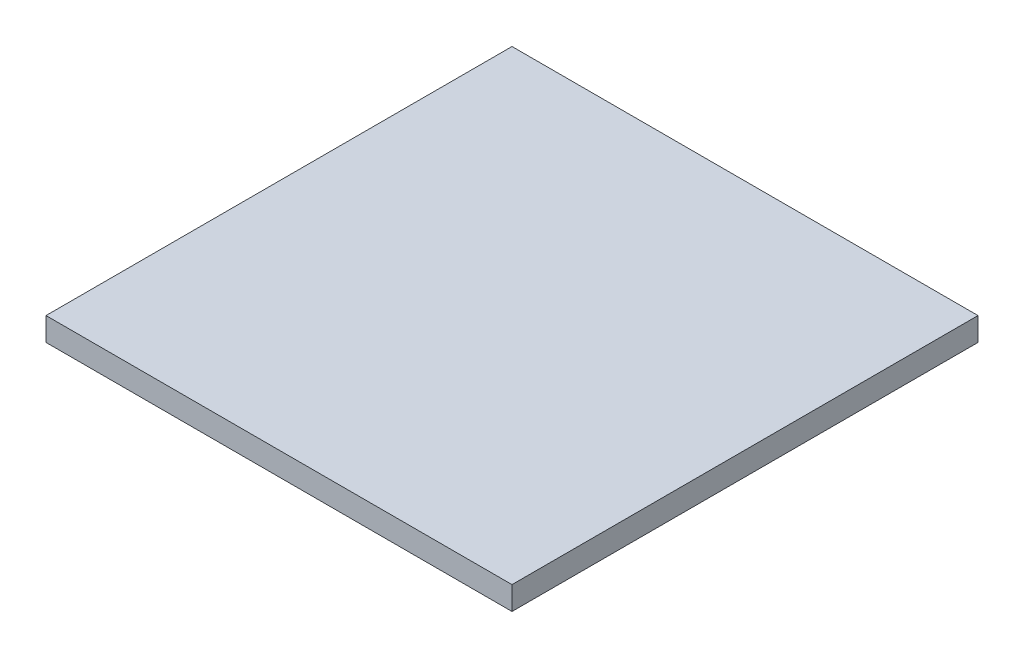
ISO-10303-21;
HEADER;
FILE_DESCRIPTION(('STEP AP214'),'2;1');
FILE_NAME('part.step','',(''),(''),'','','');
FILE_SCHEMA(('AUTOMOTIVE_DESIGN { 1 0 10303 214 1 1 1 1 }'));
ENDSEC;
DATA;
#1=APPLICATION_CONTEXT('core data for automotive mechanical design processes');
#2=APPLICATION_PROTOCOL_DEFINITION('international standard','automotive_design',2000,#1);
#3=PRODUCT_CONTEXT('',#1,'mechanical');
#4=PRODUCT('Part','Part','',(#3));
#5=PRODUCT_RELATED_PRODUCT_CATEGORY('part','',(#4));
#6=PRODUCT_DEFINITION_FORMATION('','',#4);
#7=PRODUCT_DEFINITION_CONTEXT('part definition',#1,'design');
#8=PRODUCT_DEFINITION('design','',#6,#7);
#9=PRODUCT_DEFINITION_SHAPE('','',#8);
#10=(LENGTH_UNIT() NAMED_UNIT(*) SI_UNIT(.MILLI.,.METRE.));
#11=(NAMED_UNIT(*) PLANE_ANGLE_UNIT() SI_UNIT($,.RADIAN.));
#12=(NAMED_UNIT(*) SI_UNIT($,.STERADIAN.) SOLID_ANGLE_UNIT());
#13=UNCERTAINTY_MEASURE_WITH_UNIT(LENGTH_MEASURE(1.E-05),#10,'distance_accuracy_value','');
#14=(GEOMETRIC_REPRESENTATION_CONTEXT(3) GLOBAL_UNCERTAINTY_ASSIGNED_CONTEXT((#13)) GLOBAL_UNIT_ASSIGNED_CONTEXT((#10,
#11,#12)) REPRESENTATION_CONTEXT('',''));
#15=CARTESIAN_POINT('',(0.,0.,0.));
#16=DIRECTION('',(0.,0.,1.));
#17=DIRECTION('',(1.,0.,0.));
#18=AXIS2_PLACEMENT_3D('',#15,#16,#17);
#19=CARTESIAN_POINT('',(0.,5.,0.));
#20=DIRECTION('',(1.,0.,0.));
#21=DIRECTION('',(0.,0.,-1.));
#22=AXIS2_PLACEMENT_3D('',#19,#20,#21);
#23=PLANE('',#22);
#24=DIRECTION('',(0.,0.,1.));
#25=VECTOR('',#24,1.);
#26=CARTESIAN_POINT('',(0.,0.,0.));
#27=LINE('',#26,#25);
#28=CARTESIAN_POINT('',(0.,0.,-100.));
#29=VERTEX_POINT('',#28);
#30=CARTESIAN_POINT('',(0.,0.,0.));
#31=VERTEX_POINT('',#30);
#32=EDGE_CURVE('E96',#29,#31,#27,.T.);
#33=ORIENTED_EDGE('',*,*,#32,.T.);
#34=DIRECTION('',(0.,-1.,0.));
#35=VECTOR('',#34,1.);
#36=CARTESIAN_POINT('',(0.,5.,0.));
#37=LINE('',#36,#35);
#38=CARTESIAN_POINT('',(0.,5.,0.));
#39=VERTEX_POINT('',#38);
#40=EDGE_CURVE('E11',#39,#31,#37,.T.);
#41=ORIENTED_EDGE('',*,*,#40,.F.);
#42=DIRECTION('',(0.,0.,1.));
#43=VECTOR('',#42,1.);
#44=CARTESIAN_POINT('',(0.,5.,0.));
#45=LINE('',#44,#43);
#46=CARTESIAN_POINT('',(0.,5.,-100.));
#47=VERTEX_POINT('',#46);
#48=EDGE_CURVE('E84',#47,#39,#45,.T.);
#49=ORIENTED_EDGE('',*,*,#48,.F.);
#50=DIRECTION('',(0.,-1.,0.));
#51=VECTOR('',#50,1.);
#52=CARTESIAN_POINT('',(0.,5.,-100.));
#53=LINE('',#52,#51);
#54=EDGE_CURVE('E92',#47,#29,#53,.T.);
#55=ORIENTED_EDGE('',*,*,#54,.T.);
#56=EDGE_LOOP('',(#33,#41,#49,#55));
#57=FACE_BOUND('',#56,.T.);
#58=ADVANCED_FACE('F33',(#57),#23,.F.);
#59=CARTESIAN_POINT('',(0.,5.,0.));
#60=DIRECTION('',(0.,0.,-1.));
#61=DIRECTION('',(-1.,0.,0.));
#62=AXIS2_PLACEMENT_3D('',#59,#60,#61);
#63=PLANE('',#62);
#64=DIRECTION('',(1.,0.,0.));
#65=VECTOR('',#64,1.);
#66=CARTESIAN_POINT('',(0.,0.,0.));
#67=LINE('',#66,#65);
#68=CARTESIAN_POINT('',(100.,0.,0.));
#69=VERTEX_POINT('',#68);
#70=EDGE_CURVE('E88',#31,#69,#67,.T.);
#71=ORIENTED_EDGE('',*,*,#70,.T.);
#72=DIRECTION('',(0.,-1.,0.));
#73=VECTOR('',#72,1.);
#74=CARTESIAN_POINT('',(100.,5.,0.));
#75=LINE('',#74,#73);
#76=CARTESIAN_POINT('',(100.,5.,0.));
#77=VERTEX_POINT('',#76);
#78=EDGE_CURVE('E41',#77,#69,#75,.T.);
#79=ORIENTED_EDGE('',*,*,#78,.F.);
#80=DIRECTION('',(1.,0.,0.));
#81=VECTOR('',#80,1.);
#82=CARTESIAN_POINT('',(0.,5.,0.));
#83=LINE('',#82,#81);
#84=EDGE_CURVE('E79',#39,#77,#83,.T.);
#85=ORIENTED_EDGE('',*,*,#84,.F.);
#86=ORIENTED_EDGE('',*,*,#40,.T.);
#87=EDGE_LOOP('',(#71,#79,#85,#86));
#88=FACE_BOUND('',#87,.T.);
#89=ADVANCED_FACE('F87',(#88),#63,.F.);
#90=CARTESIAN_POINT('',(100.,5.,0.));
#91=DIRECTION('',(-1.,0.,0.));
#92=DIRECTION('',(0.,0.,1.));
#93=AXIS2_PLACEMENT_3D('',#90,#91,#92);
#94=PLANE('',#93);
#95=DIRECTION('',(0.,0.,-1.));
#96=VECTOR('',#95,1.);
#97=CARTESIAN_POINT('',(100.,0.,0.));
#98=LINE('',#97,#96);
#99=CARTESIAN_POINT('',(100.,0.,-100.));
#100=VERTEX_POINT('',#99);
#101=EDGE_CURVE('E66',#69,#100,#98,.T.);
#102=ORIENTED_EDGE('',*,*,#101,.T.);
#103=DIRECTION('',(0.,-1.,0.));
#104=VECTOR('',#103,1.);
#105=CARTESIAN_POINT('',(100.,5.,-100.));
#106=LINE('',#105,#104);
#107=CARTESIAN_POINT('',(100.,5.,-100.));
#108=VERTEX_POINT('',#107);
#109=EDGE_CURVE('E89',#108,#100,#106,.T.);
#110=ORIENTED_EDGE('',*,*,#109,.F.);
#111=DIRECTION('',(0.,0.,-1.));
#112=VECTOR('',#111,1.);
#113=CARTESIAN_POINT('',(100.,5.,0.));
#114=LINE('',#113,#112);
#115=EDGE_CURVE('E82',#77,#108,#114,.T.);
#116=ORIENTED_EDGE('',*,*,#115,.F.);
#117=ORIENTED_EDGE('',*,*,#78,.T.);
#118=EDGE_LOOP('',(#102,#110,#116,#117));
#119=FACE_BOUND('',#118,.T.);
#120=ADVANCED_FACE('F90',(#119),#94,.F.);
#121=CARTESIAN_POINT('',(0.,5.,-100.));
#122=DIRECTION('',(0.,0.,1.));
#123=DIRECTION('',(1.,0.,0.));
#124=AXIS2_PLACEMENT_3D('',#121,#122,#123);
#125=PLANE('',#124);
#126=DIRECTION('',(-1.,0.,0.));
#127=VECTOR('',#126,1.);
#128=CARTESIAN_POINT('',(0.,0.,-100.));
#129=LINE('',#128,#127);
#130=EDGE_CURVE('E72',#100,#29,#129,.T.);
#131=ORIENTED_EDGE('',*,*,#130,.T.);
#132=ORIENTED_EDGE('',*,*,#54,.F.);
#133=DIRECTION('',(-1.,0.,0.));
#134=VECTOR('',#133,1.);
#135=CARTESIAN_POINT('',(0.,5.,-100.));
#136=LINE('',#135,#134);
#137=EDGE_CURVE('E49',#108,#47,#136,.T.);
#138=ORIENTED_EDGE('',*,*,#137,.F.);
#139=ORIENTED_EDGE('',*,*,#109,.T.);
#140=EDGE_LOOP('',(#131,#132,#138,#139));
#141=FACE_BOUND('',#140,.T.);
#142=ADVANCED_FACE('F103',(#141),#125,.F.);
#143=CARTESIAN_POINT('',(0.,5.,0.));
#144=DIRECTION('',(0.,-1.,0.));
#145=DIRECTION('',(0.,0.,-1.));
#146=AXIS2_PLACEMENT_3D('',#143,#144,#145);
#147=PLANE('',#146);
#148=ORIENTED_EDGE('',*,*,#48,.T.);
#149=ORIENTED_EDGE('',*,*,#84,.T.);
#150=ORIENTED_EDGE('',*,*,#115,.T.);
#151=ORIENTED_EDGE('',*,*,#137,.T.);
#152=EDGE_LOOP('',(#148,#149,#150,#151));
#153=FACE_BOUND('',#152,.T.);
#154=ADVANCED_FACE('F80',(#153),#147,.F.);
#155=CARTESIAN_POINT('',(0.,0.,0.));
#156=DIRECTION('',(0.,-1.,0.));
#157=DIRECTION('',(0.,0.,-1.));
#158=AXIS2_PLACEMENT_3D('',#155,#156,#157);
#159=PLANE('',#158);
#160=ORIENTED_EDGE('',*,*,#32,.F.);
#161=ORIENTED_EDGE('',*,*,#130,.F.);
#162=ORIENTED_EDGE('',*,*,#101,.F.);
#163=ORIENTED_EDGE('',*,*,#70,.F.);
#164=EDGE_LOOP('',(#160,#161,#162,#163));
#165=FACE_BOUND('',#164,.T.);
#166=ADVANCED_FACE('F106',(#165),#159,.T.);
#167=CLOSED_SHELL('',(#58,#89,#120,#142,#154,#166));
#168=MANIFOLD_SOLID_BREP('B2',#167);
#169=ADVANCED_BREP_SHAPE_REPRESENTATION('',(#18,#168),#14);
#170=SHAPE_DEFINITION_REPRESENTATION(#9,#169);
ENDSEC;
END-ISO-10303-21;
